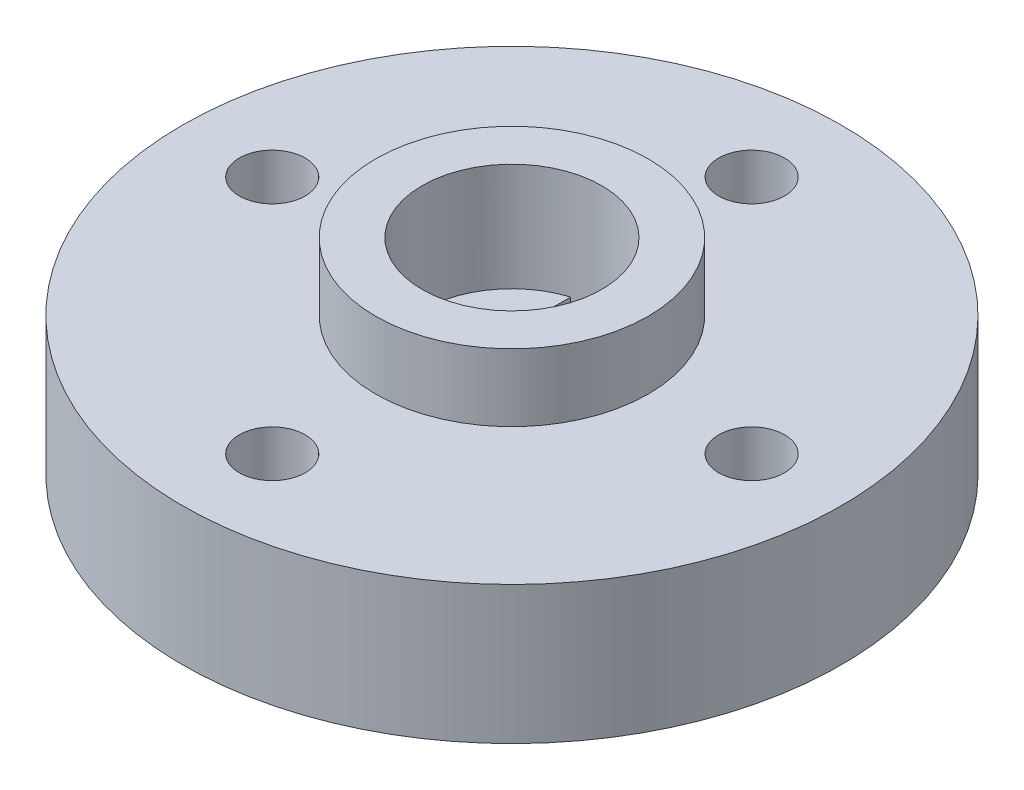
ISO-10303-21;
HEADER;
FILE_DESCRIPTION(('STEP AP214'),'2;1');
FILE_NAME('part.step','',(''),(''),'','','');
FILE_SCHEMA(('AUTOMOTIVE_DESIGN { 1 0 10303 214 1 1 1 1 }'));
ENDSEC;
DATA;
#1=APPLICATION_CONTEXT('core data for automotive mechanical design processes');
#2=APPLICATION_PROTOCOL_DEFINITION('international standard','automotive_design',2000,#1);
#3=PRODUCT_CONTEXT('',#1,'mechanical');
#4=PRODUCT('Part','Part','',(#3));
#5=PRODUCT_RELATED_PRODUCT_CATEGORY('part','',(#4));
#6=PRODUCT_DEFINITION_FORMATION('','',#4);
#7=PRODUCT_DEFINITION_CONTEXT('part definition',#1,'design');
#8=PRODUCT_DEFINITION('design','',#6,#7);
#9=PRODUCT_DEFINITION_SHAPE('','',#8);
#10=(LENGTH_UNIT() NAMED_UNIT(*) SI_UNIT(.MILLI.,.METRE.));
#11=(NAMED_UNIT(*) PLANE_ANGLE_UNIT() SI_UNIT($,.RADIAN.));
#12=(NAMED_UNIT(*) SI_UNIT($,.STERADIAN.) SOLID_ANGLE_UNIT());
#13=UNCERTAINTY_MEASURE_WITH_UNIT(LENGTH_MEASURE(1.E-05),#10,'distance_accuracy_value','');
#14=(GEOMETRIC_REPRESENTATION_CONTEXT(3) GLOBAL_UNCERTAINTY_ASSIGNED_CONTEXT((#13)) GLOBAL_UNIT_ASSIGNED_CONTEXT((#10,
#11,#12)) REPRESENTATION_CONTEXT('',''));
#15=CARTESIAN_POINT('',(0.,0.,0.));
#16=DIRECTION('',(0.,0.,1.));
#17=DIRECTION('',(1.,0.,0.));
#18=AXIS2_PLACEMENT_3D('',#15,#16,#17);
#19=CARTESIAN_POINT('',(0.,3.25,0.));
#20=DIRECTION('',(0.,1.,0.));
#21=DIRECTION('',(-1.,0.,0.));
#22=AXIS2_PLACEMENT_3D('',#19,#20,#21);
#23=CYLINDRICAL_SURFACE('',#22,11.);
#24=CARTESIAN_POINT('',(0.,4.6,0.));
#25=DIRECTION('',(0.,1.,0.));
#26=DIRECTION('',(-1.,0.,0.));
#27=AXIS2_PLACEMENT_3D('',#24,#25,#26);
#28=CIRCLE('',#27,11.);
#29=CARTESIAN_POINT('',(-11.,4.6,0.));
#30=VERTEX_POINT('',#29);
#31=EDGE_CURVE('E151',#30,#30,#28,.T.);
#32=ORIENTED_EDGE('',*,*,#31,.F.);
#33=EDGE_LOOP('',(#32));
#34=FACE_BOUND('',#33,.T.);
#35=CARTESIAN_POINT('',(0.,0.,0.));
#36=DIRECTION('',(0.,1.,0.));
#37=DIRECTION('',(-1.,0.,0.));
#38=AXIS2_PLACEMENT_3D('',#35,#36,#37);
#39=CIRCLE('',#38,11.);
#40=CARTESIAN_POINT('',(-11.,0.,0.));
#41=VERTEX_POINT('',#40);
#42=EDGE_CURVE('E133',#41,#41,#39,.T.);
#43=ORIENTED_EDGE('',*,*,#42,.T.);
#44=EDGE_LOOP('',(#43));
#45=FACE_BOUND('',#44,.T.);
#46=ADVANCED_FACE('F32',(#34,#45),#23,.T.);
#47=CARTESIAN_POINT('',(11.,4.6,0.));
#48=DIRECTION('',(0.,-1.,0.));
#49=DIRECTION('',(1.,0.,0.));
#50=AXIS2_PLACEMENT_3D('',#47,#48,#49);
#51=PLANE('',#50);
#52=CARTESIAN_POINT('',(0.,4.6,8.));
#53=DIRECTION('',(0.,-1.,0.));
#54=DIRECTION('',(1.,0.,0.));
#55=AXIS2_PLACEMENT_3D('',#52,#53,#54);
#56=CIRCLE('',#55,1.1);
#57=CARTESIAN_POINT('',(1.1,4.6,8.));
#58=VERTEX_POINT('',#57);
#59=EDGE_CURVE('E101',#58,#58,#56,.T.);
#60=ORIENTED_EDGE('',*,*,#59,.T.);
#61=EDGE_LOOP('',(#60));
#62=FACE_BOUND('',#61,.T.);
#63=CARTESIAN_POINT('',(7.99999999999999,4.6,0.));
#64=DIRECTION('',(0.,-1.,0.));
#65=DIRECTION('',(1.,0.,0.));
#66=AXIS2_PLACEMENT_3D('',#63,#64,#65);
#67=CIRCLE('',#66,1.1);
#68=CARTESIAN_POINT('',(9.1,4.6,0.));
#69=VERTEX_POINT('',#68);
#70=EDGE_CURVE('E104',#69,#69,#67,.T.);
#71=ORIENTED_EDGE('',*,*,#70,.T.);
#72=EDGE_LOOP('',(#71));
#73=FACE_BOUND('',#72,.T.);
#74=CARTESIAN_POINT('',(0.,4.6,-8.));
#75=DIRECTION('',(0.,-1.,0.));
#76=DIRECTION('',(1.,0.,0.));
#77=AXIS2_PLACEMENT_3D('',#74,#75,#76);
#78=CIRCLE('',#77,1.1);
#79=CARTESIAN_POINT('',(1.1,4.6,-8.));
#80=VERTEX_POINT('',#79);
#81=EDGE_CURVE('E208',#80,#80,#78,.T.);
#82=ORIENTED_EDGE('',*,*,#81,.T.);
#83=EDGE_LOOP('',(#82));
#84=FACE_BOUND('',#83,.T.);
#85=CARTESIAN_POINT('',(-8.,4.6,0.));
#86=DIRECTION('',(0.,-1.,0.));
#87=DIRECTION('',(1.,0.,0.));
#88=AXIS2_PLACEMENT_3D('',#85,#86,#87);
#89=CIRCLE('',#88,1.1);
#90=CARTESIAN_POINT('',(-6.9,4.6,0.));
#91=VERTEX_POINT('',#90);
#92=EDGE_CURVE('E212',#91,#91,#89,.T.);
#93=ORIENTED_EDGE('',*,*,#92,.T.);
#94=EDGE_LOOP('',(#93));
#95=FACE_BOUND('',#94,.T.);
#96=CARTESIAN_POINT('',(0.,4.6,0.));
#97=DIRECTION('',(0.,1.,0.));
#98=DIRECTION('',(-1.,0.,0.));
#99=AXIS2_PLACEMENT_3D('',#96,#97,#98);
#100=CIRCLE('',#99,4.55);
#101=CARTESIAN_POINT('',(-4.55,4.6,0.));
#102=VERTEX_POINT('',#101);
#103=EDGE_CURVE('E148',#102,#102,#100,.T.);
#104=ORIENTED_EDGE('',*,*,#103,.F.);
#105=EDGE_LOOP('',(#104));
#106=FACE_BOUND('',#105,.T.);
#107=ORIENTED_EDGE('',*,*,#31,.T.);
#108=EDGE_LOOP('',(#107));
#109=FACE_BOUND('',#108,.T.);
#110=ADVANCED_FACE('F155',(#62,#73,#84,#95,#106,#109),#51,.F.);
#111=CARTESIAN_POINT('',(0.,3.25,0.));
#112=DIRECTION('',(0.,1.,0.));
#113=DIRECTION('',(-1.,0.,0.));
#114=AXIS2_PLACEMENT_3D('',#111,#112,#113);
#115=CYLINDRICAL_SURFACE('',#114,4.55);
#116=CARTESIAN_POINT('',(0.,6.85,0.));
#117=DIRECTION('',(0.,1.,0.));
#118=DIRECTION('',(-1.,0.,0.));
#119=AXIS2_PLACEMENT_3D('',#116,#117,#118);
#120=CIRCLE('',#119,4.55);
#121=CARTESIAN_POINT('',(-4.55,6.85,0.));
#122=VERTEX_POINT('',#121);
#123=EDGE_CURVE('E145',#122,#122,#120,.T.);
#124=ORIENTED_EDGE('',*,*,#123,.F.);
#125=EDGE_LOOP('',(#124));
#126=FACE_BOUND('',#125,.T.);
#127=ORIENTED_EDGE('',*,*,#103,.T.);
#128=EDGE_LOOP('',(#127));
#129=FACE_BOUND('',#128,.T.);
#130=ADVANCED_FACE('F192',(#126,#129),#115,.T.);
#131=CARTESIAN_POINT('',(4.55,6.85,0.));
#132=DIRECTION('',(0.,-1.,0.));
#133=DIRECTION('',(1.,0.,0.));
#134=AXIS2_PLACEMENT_3D('',#131,#132,#133);
#135=PLANE('',#134);
#136=CARTESIAN_POINT('',(0.,6.85,0.));
#137=DIRECTION('',(0.,1.,0.));
#138=DIRECTION('',(-1.,0.,0.));
#139=AXIS2_PLACEMENT_3D('',#136,#137,#138);
#140=CIRCLE('',#139,3.);
#141=CARTESIAN_POINT('',(-3.,6.85,0.));
#142=VERTEX_POINT('',#141);
#143=EDGE_CURVE('E142',#142,#142,#140,.T.);
#144=ORIENTED_EDGE('',*,*,#143,.F.);
#145=EDGE_LOOP('',(#144));
#146=FACE_BOUND('',#145,.T.);
#147=ORIENTED_EDGE('',*,*,#123,.T.);
#148=EDGE_LOOP('',(#147));
#149=FACE_BOUND('',#148,.T.);
#150=ADVANCED_FACE('F189',(#146,#149),#135,.F.);
#151=CARTESIAN_POINT('',(0.,3.25,0.));
#152=DIRECTION('',(0.,1.,0.));
#153=DIRECTION('',(-1.,0.,0.));
#154=AXIS2_PLACEMENT_3D('',#151,#152,#153);
#155=CYLINDRICAL_SURFACE('',#154,3.);
#156=DIRECTION('',(0.,1.,0.));
#157=VECTOR('',#156,1.);
#158=CARTESIAN_POINT('',(0.9,0.,-2.86181760425084));
#159=LINE('',#158,#157);
#160=CARTESIAN_POINT('',(0.9,0.,-2.86181760425084));
#161=VERTEX_POINT('',#160);
#162=CARTESIAN_POINT('',(0.9,3.25,-2.86181760425084));
#163=VERTEX_POINT('',#162);
#164=EDGE_CURVE('E108',#161,#163,#159,.T.);
#165=ORIENTED_EDGE('',*,*,#164,.T.);
#166=CARTESIAN_POINT('',(0.,3.25,0.));
#167=DIRECTION('',(0.,1.,0.));
#168=DIRECTION('',(-1.,0.,0.));
#169=AXIS2_PLACEMENT_3D('',#166,#167,#168);
#170=CIRCLE('',#169,3.);
#171=CARTESIAN_POINT('',(-0.9,3.25,-2.86181760425084));
#172=VERTEX_POINT('',#171);
#173=EDGE_CURVE('E90',#172,#163,#170,.T.);
#174=ORIENTED_EDGE('',*,*,#173,.F.);
#175=DIRECTION('',(0.,1.,0.));
#176=VECTOR('',#175,1.);
#177=CARTESIAN_POINT('',(-0.9,0.,-2.86181760425084));
#178=LINE('',#177,#176);
#179=CARTESIAN_POINT('',(-0.9,0.,-2.86181760425084));
#180=VERTEX_POINT('',#179);
#181=EDGE_CURVE('E46',#180,#172,#178,.T.);
#182=ORIENTED_EDGE('',*,*,#181,.F.);
#183=CARTESIAN_POINT('',(0.,0.,0.));
#184=DIRECTION('',(0.,1.,0.));
#185=DIRECTION('',(-1.,0.,0.));
#186=AXIS2_PLACEMENT_3D('',#183,#184,#185);
#187=CIRCLE('',#186,3.);
#188=EDGE_CURVE('E87',#161,#180,#187,.T.);
#189=ORIENTED_EDGE('',*,*,#188,.F.);
#190=EDGE_LOOP('',(#165,#174,#182,#189));
#191=FACE_BOUND('',#190,.T.);
#192=ORIENTED_EDGE('',*,*,#143,.T.);
#193=EDGE_LOOP('',(#192));
#194=FACE_BOUND('',#193,.T.);
#195=ADVANCED_FACE('F84',(#191,#194),#155,.F.);
#196=CARTESIAN_POINT('',(3.,3.25,0.));
#197=DIRECTION('',(0.,-1.,0.));
#198=DIRECTION('',(1.,0.,0.));
#199=AXIS2_PLACEMENT_3D('',#196,#197,#198);
#200=PLANE('',#199);
#201=ORIENTED_EDGE('',*,*,#173,.T.);
#202=DIRECTION('',(0.,0.,1.));
#203=VECTOR('',#202,1.);
#204=CARTESIAN_POINT('',(0.9,3.25,0.));
#205=LINE('',#204,#203);
#206=CARTESIAN_POINT('',(0.9,3.25,-0.867467578644873));
#207=VERTEX_POINT('',#206);
#208=EDGE_CURVE('E127',#163,#207,#205,.T.);
#209=ORIENTED_EDGE('',*,*,#208,.T.);
#210=CARTESIAN_POINT('',(0.,3.25,0.));
#211=DIRECTION('',(0.,-1.,0.));
#212=DIRECTION('',(1.,0.,0.));
#213=AXIS2_PLACEMENT_3D('',#210,#211,#212);
#214=CIRCLE('',#213,1.25);
#215=CARTESIAN_POINT('',(-0.9,3.25,-0.867467578644874));
#216=VERTEX_POINT('',#215);
#217=EDGE_CURVE('E130',#207,#216,#214,.T.);
#218=ORIENTED_EDGE('',*,*,#217,.T.);
#219=DIRECTION('',(0.,0.,-1.));
#220=VECTOR('',#219,1.);
#221=CARTESIAN_POINT('',(-0.9,3.25,0.));
#222=LINE('',#221,#220);
#223=EDGE_CURVE('E119',#216,#172,#222,.T.);
#224=ORIENTED_EDGE('',*,*,#223,.T.);
#225=EDGE_LOOP('',(#201,#209,#218,#224));
#226=FACE_BOUND('',#225,.T.);
#227=ADVANCED_FACE('F182',(#226),#200,.F.);
#228=CARTESIAN_POINT('',(0.,1.6,0.));
#229=DIRECTION('',(0.,1.,0.));
#230=DIRECTION('',(-1.,0.,0.));
#231=AXIS2_PLACEMENT_3D('',#228,#229,#230);
#232=PLANE('',#231);
#233=CARTESIAN_POINT('',(0.,1.6,0.));
#234=DIRECTION('',(0.,1.,0.));
#235=DIRECTION('',(-1.,0.,0.));
#236=AXIS2_PLACEMENT_3D('',#233,#234,#235);
#237=CIRCLE('',#236,1.25);
#238=CARTESIAN_POINT('',(-0.9,1.6,-0.867467578644874));
#239=VERTEX_POINT('',#238);
#240=CARTESIAN_POINT('',(0.9,1.6,-0.867467578644873));
#241=VERTEX_POINT('',#240);
#242=EDGE_CURVE('E11',#239,#241,#237,.T.);
#243=ORIENTED_EDGE('',*,*,#242,.T.);
#244=DIRECTION('',(0.,0.,-1.));
#245=VECTOR('',#244,1.);
#246=CARTESIAN_POINT('',(0.9,1.6,0.));
#247=LINE('',#246,#245);
#248=CARTESIAN_POINT('',(0.9,1.6,-2.70416345659799));
#249=VERTEX_POINT('',#248);
#250=EDGE_CURVE('E124',#241,#249,#247,.T.);
#251=ORIENTED_EDGE('',*,*,#250,.T.);
#252=CARTESIAN_POINT('',(0.,1.6,0.));
#253=DIRECTION('',(0.,1.,0.));
#254=DIRECTION('',(-1.,0.,0.));
#255=AXIS2_PLACEMENT_3D('',#252,#253,#254);
#256=CIRCLE('',#255,2.85);
#257=CARTESIAN_POINT('',(-0.9,1.6,-2.70416345659799));
#258=VERTEX_POINT('',#257);
#259=EDGE_CURVE('E138',#258,#249,#256,.T.);
#260=ORIENTED_EDGE('',*,*,#259,.F.);
#261=DIRECTION('',(0.,0.,1.));
#262=VECTOR('',#261,1.);
#263=CARTESIAN_POINT('',(-0.9,1.6,0.));
#264=LINE('',#263,#262);
#265=EDGE_CURVE('E116',#258,#239,#264,.T.);
#266=ORIENTED_EDGE('',*,*,#265,.T.);
#267=EDGE_LOOP('',(#243,#251,#260,#266));
#268=FACE_BOUND('',#267,.T.);
#269=ADVANCED_FACE('F173',(#268),#232,.F.);
#270=CARTESIAN_POINT('',(0.,3.25,0.));
#271=DIRECTION('',(0.,1.,0.));
#272=DIRECTION('',(-1.,0.,0.));
#273=AXIS2_PLACEMENT_3D('',#270,#271,#272);
#274=CYLINDRICAL_SURFACE('',#273,2.85);
#275=ORIENTED_EDGE('',*,*,#259,.T.);
#276=DIRECTION('',(0.,1.,0.));
#277=VECTOR('',#276,1.);
#278=CARTESIAN_POINT('',(0.899999999999999,3.25,-2.70416345659799));
#279=LINE('',#278,#277);
#280=CARTESIAN_POINT('',(0.9,0.,-2.70416345659799));
#281=VERTEX_POINT('',#280);
#282=EDGE_CURVE('E121',#249,#281,#279,.F.);
#283=ORIENTED_EDGE('',*,*,#282,.T.);
#284=CARTESIAN_POINT('',(0.,0.,0.));
#285=DIRECTION('',(0.,1.,0.));
#286=DIRECTION('',(-1.,0.,0.));
#287=AXIS2_PLACEMENT_3D('',#284,#285,#286);
#288=CIRCLE('',#287,2.85);
#289=CARTESIAN_POINT('',(-0.9,0.,-2.70416345659799));
#290=VERTEX_POINT('',#289);
#291=EDGE_CURVE('E136',#290,#281,#288,.T.);
#292=ORIENTED_EDGE('',*,*,#291,.F.);
#293=DIRECTION('',(0.,1.,0.));
#294=VECTOR('',#293,1.);
#295=CARTESIAN_POINT('',(-0.9,3.25,-2.70416345659799));
#296=LINE('',#295,#294);
#297=EDGE_CURVE('E52',#290,#258,#296,.T.);
#298=ORIENTED_EDGE('',*,*,#297,.T.);
#299=EDGE_LOOP('',(#275,#283,#292,#298));
#300=FACE_BOUND('',#299,.T.);
#301=ADVANCED_FACE('F163',(#300),#274,.F.);
#302=CARTESIAN_POINT('',(2.85,0.,0.));
#303=DIRECTION('',(0.,1.,0.));
#304=DIRECTION('',(-1.,0.,0.));
#305=AXIS2_PLACEMENT_3D('',#302,#303,#304);
#306=PLANE('',#305);
#307=CARTESIAN_POINT('',(0.,0.,8.));
#308=DIRECTION('',(0.,-1.,0.));
#309=DIRECTION('',(1.,0.,0.));
#310=AXIS2_PLACEMENT_3D('',#307,#308,#309);
#311=CIRCLE('',#310,1.1);
#312=CARTESIAN_POINT('',(1.1,0.,8.));
#313=VERTEX_POINT('',#312);
#314=EDGE_CURVE('E216',#313,#313,#311,.T.);
#315=ORIENTED_EDGE('',*,*,#314,.F.);
#316=EDGE_LOOP('',(#315));
#317=FACE_BOUND('',#316,.T.);
#318=CARTESIAN_POINT('',(8.,0.,0.));
#319=DIRECTION('',(0.,-1.,0.));
#320=DIRECTION('',(1.,0.,0.));
#321=AXIS2_PLACEMENT_3D('',#318,#319,#320);
#322=CIRCLE('',#321,1.1);
#323=CARTESIAN_POINT('',(9.1,0.,0.));
#324=VERTEX_POINT('',#323);
#325=EDGE_CURVE('E220',#324,#324,#322,.T.);
#326=ORIENTED_EDGE('',*,*,#325,.F.);
#327=EDGE_LOOP('',(#326));
#328=FACE_BOUND('',#327,.T.);
#329=CARTESIAN_POINT('',(0.,0.,-8.));
#330=DIRECTION('',(0.,-1.,0.));
#331=DIRECTION('',(1.,0.,0.));
#332=AXIS2_PLACEMENT_3D('',#329,#330,#331);
#333=CIRCLE('',#332,1.1);
#334=CARTESIAN_POINT('',(1.1,0.,-8.));
#335=VERTEX_POINT('',#334);
#336=EDGE_CURVE('E226',#335,#335,#333,.T.);
#337=ORIENTED_EDGE('',*,*,#336,.F.);
#338=EDGE_LOOP('',(#337));
#339=FACE_BOUND('',#338,.T.);
#340=CARTESIAN_POINT('',(-8.,0.,0.));
#341=DIRECTION('',(0.,-1.,0.));
#342=DIRECTION('',(1.,0.,0.));
#343=AXIS2_PLACEMENT_3D('',#340,#341,#342);
#344=CIRCLE('',#343,1.1);
#345=CARTESIAN_POINT('',(-6.9,0.,0.));
#346=VERTEX_POINT('',#345);
#347=EDGE_CURVE('E223',#346,#346,#344,.T.);
#348=ORIENTED_EDGE('',*,*,#347,.F.);
#349=EDGE_LOOP('',(#348));
#350=FACE_BOUND('',#349,.T.);
#351=ORIENTED_EDGE('',*,*,#42,.F.);
#352=EDGE_LOOP('',(#351));
#353=FACE_BOUND('',#352,.T.);
#354=ORIENTED_EDGE('',*,*,#291,.T.);
#355=DIRECTION('',(0.,0.,-1.));
#356=VECTOR('',#355,1.);
#357=CARTESIAN_POINT('',(0.9,0.,0.));
#358=LINE('',#357,#356);
#359=EDGE_CURVE('E39',#281,#161,#358,.T.);
#360=ORIENTED_EDGE('',*,*,#359,.T.);
#361=ORIENTED_EDGE('',*,*,#188,.T.);
#362=DIRECTION('',(0.,0.,1.));
#363=VECTOR('',#362,1.);
#364=CARTESIAN_POINT('',(-0.9,0.,-2.86181760425084));
#365=LINE('',#364,#363);
#366=EDGE_CURVE('E92',#180,#290,#365,.T.);
#367=ORIENTED_EDGE('',*,*,#366,.T.);
#368=EDGE_LOOP('',(#354,#360,#361,#367));
#369=FACE_BOUND('',#368,.T.);
#370=ADVANCED_FACE('F100',(#317,#328,#339,#350,#353,#369),#306,.F.);
#371=CARTESIAN_POINT('',(0.,0.,0.));
#372=DIRECTION('',(0.,1.,0.));
#373=DIRECTION('',(-1.,0.,0.));
#374=AXIS2_PLACEMENT_3D('',#371,#372,#373);
#375=CYLINDRICAL_SURFACE('',#374,1.25);
#376=DIRECTION('',(0.,1.,0.));
#377=VECTOR('',#376,1.);
#378=CARTESIAN_POINT('',(0.9,0.,-0.867467578644873));
#379=LINE('',#378,#377);
#380=EDGE_CURVE('E110',#241,#207,#379,.T.);
#381=ORIENTED_EDGE('',*,*,#380,.F.);
#382=ORIENTED_EDGE('',*,*,#242,.F.);
#383=DIRECTION('',(0.,1.,0.));
#384=VECTOR('',#383,1.);
#385=CARTESIAN_POINT('',(-0.9,0.,-0.867467578644874));
#386=LINE('',#385,#384);
#387=EDGE_CURVE('E91',#239,#216,#386,.T.);
#388=ORIENTED_EDGE('',*,*,#387,.T.);
#389=ORIENTED_EDGE('',*,*,#217,.F.);
#390=EDGE_LOOP('',(#381,#382,#388,#389));
#391=FACE_BOUND('',#390,.T.);
#392=ADVANCED_FACE('F162',(#391),#375,.F.);
#393=CARTESIAN_POINT('',(0.9,0.,-2.86181760425084));
#394=DIRECTION('',(1.,0.,0.));
#395=DIRECTION('',(0.,1.,0.));
#396=AXIS2_PLACEMENT_3D('',#393,#394,#395);
#397=PLANE('',#396);
#398=ORIENTED_EDGE('',*,*,#164,.F.);
#399=ORIENTED_EDGE('',*,*,#359,.F.);
#400=ORIENTED_EDGE('',*,*,#282,.F.);
#401=ORIENTED_EDGE('',*,*,#250,.F.);
#402=ORIENTED_EDGE('',*,*,#380,.T.);
#403=ORIENTED_EDGE('',*,*,#208,.F.);
#404=EDGE_LOOP('',(#398,#399,#400,#401,#402,#403));
#405=FACE_BOUND('',#404,.T.);
#406=ADVANCED_FACE('F170',(#405),#397,.F.);
#407=CARTESIAN_POINT('',(-0.9,0.,-2.86181760425084));
#408=DIRECTION('',(-1.,0.,0.));
#409=DIRECTION('',(0.,-1.,0.));
#410=AXIS2_PLACEMENT_3D('',#407,#408,#409);
#411=PLANE('',#410);
#412=ORIENTED_EDGE('',*,*,#387,.F.);
#413=ORIENTED_EDGE('',*,*,#265,.F.);
#414=ORIENTED_EDGE('',*,*,#297,.F.);
#415=ORIENTED_EDGE('',*,*,#366,.F.);
#416=ORIENTED_EDGE('',*,*,#181,.T.);
#417=ORIENTED_EDGE('',*,*,#223,.F.);
#418=EDGE_LOOP('',(#412,#413,#414,#415,#416,#417));
#419=FACE_BOUND('',#418,.T.);
#420=ADVANCED_FACE('F95',(#419),#411,.F.);
#421=CARTESIAN_POINT('',(-8.,10.,0.));
#422=DIRECTION('',(0.,-1.,0.));
#423=DIRECTION('',(1.,0.,0.));
#424=AXIS2_PLACEMENT_3D('',#421,#422,#423);
#425=CYLINDRICAL_SURFACE('',#424,1.1);
#426=ORIENTED_EDGE('',*,*,#347,.T.);
#427=EDGE_LOOP('',(#426));
#428=FACE_BOUND('',#427,.T.);
#429=ORIENTED_EDGE('',*,*,#92,.F.);
#430=EDGE_LOOP('',(#429));
#431=FACE_BOUND('',#430,.T.);
#432=ADVANCED_FACE('F239',(#428,#431),#425,.F.);
#433=CARTESIAN_POINT('',(0.,10.,-8.));
#434=DIRECTION('',(0.,-1.,0.));
#435=DIRECTION('',(1.,0.,0.));
#436=AXIS2_PLACEMENT_3D('',#433,#434,#435);
#437=CYLINDRICAL_SURFACE('',#436,1.1);
#438=ORIENTED_EDGE('',*,*,#336,.T.);
#439=EDGE_LOOP('',(#438));
#440=FACE_BOUND('',#439,.T.);
#441=ORIENTED_EDGE('',*,*,#81,.F.);
#442=EDGE_LOOP('',(#441));
#443=FACE_BOUND('',#442,.T.);
#444=ADVANCED_FACE('F241',(#440,#443),#437,.F.);
#445=CARTESIAN_POINT('',(7.99999999999999,10.,0.));
#446=DIRECTION('',(0.,-1.,0.));
#447=DIRECTION('',(1.,0.,0.));
#448=AXIS2_PLACEMENT_3D('',#445,#446,#447);
#449=CYLINDRICAL_SURFACE('',#448,1.1);
#450=ORIENTED_EDGE('',*,*,#325,.T.);
#451=EDGE_LOOP('',(#450));
#452=FACE_BOUND('',#451,.T.);
#453=ORIENTED_EDGE('',*,*,#70,.F.);
#454=EDGE_LOOP('',(#453));
#455=FACE_BOUND('',#454,.T.);
#456=ADVANCED_FACE('F232',(#452,#455),#449,.F.);
#457=CARTESIAN_POINT('',(0.,10.,8.));
#458=DIRECTION('',(0.,-1.,0.));
#459=DIRECTION('',(1.,0.,0.));
#460=AXIS2_PLACEMENT_3D('',#457,#458,#459);
#461=CYLINDRICAL_SURFACE('',#460,1.1);
#462=ORIENTED_EDGE('',*,*,#314,.T.);
#463=EDGE_LOOP('',(#462));
#464=FACE_BOUND('',#463,.T.);
#465=ORIENTED_EDGE('',*,*,#59,.F.);
#466=EDGE_LOOP('',(#465));
#467=FACE_BOUND('',#466,.T.);
#468=ADVANCED_FACE('F294',(#464,#467),#461,.F.);
#469=CLOSED_SHELL('',(#46,#110,#130,#150,#195,#227,#269,#301,#370,#392,#406,#420,#432,#444,#456,#468));
#470=MANIFOLD_SOLID_BREP('B2',#469);
#471=ADVANCED_BREP_SHAPE_REPRESENTATION('',(#18,#470),#14);
#472=SHAPE_DEFINITION_REPRESENTATION(#9,#471);
ENDSEC;
END-ISO-10303-21;
